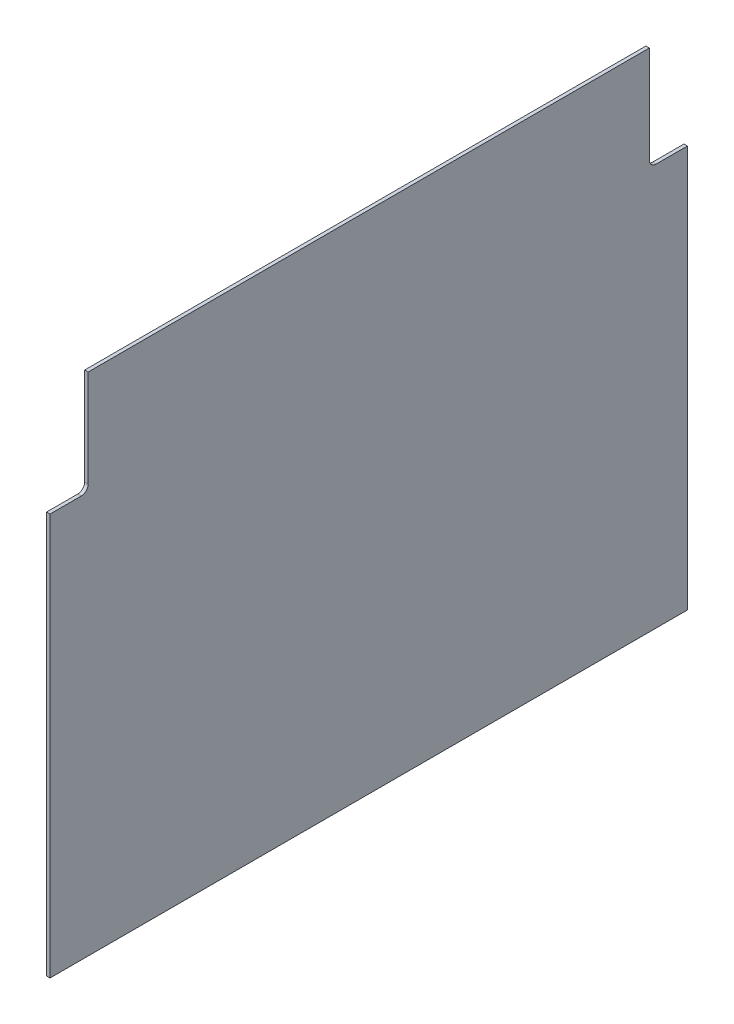
ISO-10303-21;
HEADER;
FILE_DESCRIPTION(('STEP AP214'),'2;1');
FILE_NAME('part.step','',(''),(''),'','','');
FILE_SCHEMA(('AUTOMOTIVE_DESIGN { 1 0 10303 214 1 1 1 1 }'));
ENDSEC;
DATA;
#1=APPLICATION_CONTEXT('core data for automotive mechanical design processes');
#2=APPLICATION_PROTOCOL_DEFINITION('international standard','automotive_design',2000,#1);
#3=PRODUCT_CONTEXT('',#1,'mechanical');
#4=PRODUCT('Part','Part','',(#3));
#5=PRODUCT_RELATED_PRODUCT_CATEGORY('part','',(#4));
#6=PRODUCT_DEFINITION_FORMATION('','',#4);
#7=PRODUCT_DEFINITION_CONTEXT('part definition',#1,'design');
#8=PRODUCT_DEFINITION('design','',#6,#7);
#9=PRODUCT_DEFINITION_SHAPE('','',#8);
#10=(LENGTH_UNIT() NAMED_UNIT(*) SI_UNIT(.MILLI.,.METRE.));
#11=(NAMED_UNIT(*) PLANE_ANGLE_UNIT() SI_UNIT($,.RADIAN.));
#12=(NAMED_UNIT(*) SI_UNIT($,.STERADIAN.) SOLID_ANGLE_UNIT());
#13=UNCERTAINTY_MEASURE_WITH_UNIT(LENGTH_MEASURE(1.E-05),#10,'distance_accuracy_value','');
#14=(GEOMETRIC_REPRESENTATION_CONTEXT(3) GLOBAL_UNCERTAINTY_ASSIGNED_CONTEXT((#13)) GLOBAL_UNIT_ASSIGNED_CONTEXT((#10,
#11,#12)) REPRESENTATION_CONTEXT('',''));
#15=CARTESIAN_POINT('',(0.,0.,0.));
#16=DIRECTION('',(0.,0.,1.));
#17=DIRECTION('',(1.,0.,0.));
#18=AXIS2_PLACEMENT_3D('',#15,#16,#17);
#19=CARTESIAN_POINT('',(3.175,0.,0.));
#20=DIRECTION('',(1.,0.,0.));
#21=DIRECTION('',(0.,0.,-1.));
#22=AXIS2_PLACEMENT_3D('',#19,#20,#21);
#23=PLANE('',#22);
#24=CARTESIAN_POINT('',(3.175,374.65,-555.625));
#25=DIRECTION('',(1.,0.,0.));
#26=DIRECTION('',(0.,0.,-1.));
#27=AXIS2_PLACEMENT_3D('',#24,#25,#26);
#28=CIRCLE('',#27,6.35);
#29=CARTESIAN_POINT('',(3.175,368.3,-555.625));
#30=VERTEX_POINT('',#29);
#31=CARTESIAN_POINT('',(3.175,374.65,-549.275));
#32=VERTEX_POINT('',#31);
#33=EDGE_CURVE('E19',#30,#32,#28,.F.);
#34=ORIENTED_EDGE('',*,*,#33,.T.);
#35=DIRECTION('',(0.,1.,0.));
#36=VECTOR('',#35,1.);
#37=CARTESIAN_POINT('',(3.175,368.3,-549.275));
#38=LINE('',#37,#36);
#39=CARTESIAN_POINT('',(3.175,463.55,-549.275));
#40=VERTEX_POINT('',#39);
#41=EDGE_CURVE('E95',#40,#32,#38,.F.);
#42=ORIENTED_EDGE('',*,*,#41,.F.);
#43=DIRECTION('',(0.,0.,1.));
#44=VECTOR('',#43,1.);
#45=CARTESIAN_POINT('',(3.175,463.55,-549.275));
#46=LINE('',#45,#44);
#47=CARTESIAN_POINT('',(3.175,463.55,-34.925));
#48=VERTEX_POINT('',#47);
#49=EDGE_CURVE('E111',#48,#40,#46,.F.);
#50=ORIENTED_EDGE('',*,*,#49,.F.);
#51=DIRECTION('',(0.,1.,0.));
#52=VECTOR('',#51,1.);
#53=CARTESIAN_POINT('',(3.175,463.55,-34.925));
#54=LINE('',#53,#52);
#55=CARTESIAN_POINT('',(3.175,374.65,-34.925));
#56=VERTEX_POINT('',#55);
#57=EDGE_CURVE('E152',#56,#48,#54,.T.);
#58=ORIENTED_EDGE('',*,*,#57,.F.);
#59=CARTESIAN_POINT('',(3.175,374.65,-28.575));
#60=DIRECTION('',(1.,0.,0.));
#61=DIRECTION('',(0.,0.,-1.));
#62=AXIS2_PLACEMENT_3D('',#59,#60,#61);
#63=CIRCLE('',#62,6.35);
#64=CARTESIAN_POINT('',(3.175,368.3,-28.575));
#65=VERTEX_POINT('',#64);
#66=EDGE_CURVE('E137',#56,#65,#63,.F.);
#67=ORIENTED_EDGE('',*,*,#66,.T.);
#68=DIRECTION('',(0.,0.,1.));
#69=VECTOR('',#68,1.);
#70=CARTESIAN_POINT('',(3.175,368.3,-34.925));
#71=LINE('',#70,#69);
#72=CARTESIAN_POINT('',(3.175,368.3,0.));
#73=VERTEX_POINT('',#72);
#74=EDGE_CURVE('E134',#73,#65,#71,.F.);
#75=ORIENTED_EDGE('',*,*,#74,.F.);
#76=DIRECTION('',(0.,1.,0.));
#77=VECTOR('',#76,1.);
#78=CARTESIAN_POINT('',(3.175,368.3,0.));
#79=LINE('',#78,#77);
#80=CARTESIAN_POINT('',(3.175,0.,0.));
#81=VERTEX_POINT('',#80);
#82=EDGE_CURVE('E140',#81,#73,#79,.T.);
#83=ORIENTED_EDGE('',*,*,#82,.F.);
#84=DIRECTION('',(0.,0.,-1.));
#85=VECTOR('',#84,1.);
#86=CARTESIAN_POINT('',(3.175,0.,0.));
#87=LINE('',#86,#85);
#88=CARTESIAN_POINT('',(3.175,0.,-584.2));
#89=VERTEX_POINT('',#88);
#90=EDGE_CURVE('E145',#89,#81,#87,.F.);
#91=ORIENTED_EDGE('',*,*,#90,.F.);
#92=DIRECTION('',(0.,1.,0.));
#93=VECTOR('',#92,1.);
#94=CARTESIAN_POINT('',(3.175,0.,-584.2));
#95=LINE('',#94,#93);
#96=CARTESIAN_POINT('',(3.175,368.3,-584.2));
#97=VERTEX_POINT('',#96);
#98=EDGE_CURVE('E122',#97,#89,#95,.F.);
#99=ORIENTED_EDGE('',*,*,#98,.F.);
#100=DIRECTION('',(0.,0.,1.));
#101=VECTOR('',#100,1.);
#102=CARTESIAN_POINT('',(3.175,368.3,-584.2));
#103=LINE('',#102,#101);
#104=EDGE_CURVE('E89',#30,#97,#103,.F.);
#105=ORIENTED_EDGE('',*,*,#104,.F.);
#106=EDGE_LOOP('',(#34,#42,#50,#58,#67,#75,#83,#91,#99,#105));
#107=FACE_BOUND('',#106,.T.);
#108=ADVANCED_FACE('F16',(#107),#23,.T.);
#109=CARTESIAN_POINT('',(0.,368.3,-584.2));
#110=DIRECTION('',(0.,1.,0.));
#111=DIRECTION('',(0.,0.,1.));
#112=AXIS2_PLACEMENT_3D('',#109,#110,#111);
#113=PLANE('',#112);
#114=DIRECTION('',(0.,0.,-1.));
#115=VECTOR('',#114,1.);
#116=CARTESIAN_POINT('',(0.,368.3,0.));
#117=LINE('',#116,#115);
#118=CARTESIAN_POINT('',(0.,368.3,-584.2));
#119=VERTEX_POINT('',#118);
#120=CARTESIAN_POINT('',(0.,368.3,-555.625));
#121=VERTEX_POINT('',#120);
#122=EDGE_CURVE('E167',#119,#121,#117,.F.);
#123=ORIENTED_EDGE('',*,*,#122,.T.);
#124=DIRECTION('',(1.,0.,0.));
#125=VECTOR('',#124,1.);
#126=CARTESIAN_POINT('',(-7.95655,368.3,-555.625));
#127=LINE('',#126,#125);
#128=EDGE_CURVE('E106',#121,#30,#127,.T.);
#129=ORIENTED_EDGE('',*,*,#128,.T.);
#130=ORIENTED_EDGE('',*,*,#104,.T.);
#131=DIRECTION('',(-1.,0.,0.));
#132=VECTOR('',#131,1.);
#133=CARTESIAN_POINT('',(0.,368.3,-584.2));
#134=LINE('',#133,#132);
#135=EDGE_CURVE('E119',#119,#97,#134,.F.);
#136=ORIENTED_EDGE('',*,*,#135,.F.);
#137=EDGE_LOOP('',(#123,#129,#130,#136));
#138=FACE_BOUND('',#137,.T.);
#139=ADVANCED_FACE('F318',(#138),#113,.T.);
#140=CARTESIAN_POINT('',(-7.95655,374.65,-555.625));
#141=DIRECTION('',(1.,0.,0.));
#142=DIRECTION('',(0.,0.,-1.));
#143=AXIS2_PLACEMENT_3D('',#140,#141,#142);
#144=CYLINDRICAL_SURFACE('',#143,6.35);
#145=ORIENTED_EDGE('',*,*,#128,.F.);
#146=CARTESIAN_POINT('',(0.,374.65,-555.625));
#147=DIRECTION('',(1.,0.,0.));
#148=DIRECTION('',(0.,0.,-1.));
#149=AXIS2_PLACEMENT_3D('',#146,#147,#148);
#150=CIRCLE('',#149,6.35);
#151=CARTESIAN_POINT('',(0.,374.65,-549.275));
#152=VERTEX_POINT('',#151);
#153=EDGE_CURVE('E110',#121,#152,#150,.F.);
#154=ORIENTED_EDGE('',*,*,#153,.T.);
#155=DIRECTION('',(-1.,0.,0.));
#156=VECTOR('',#155,1.);
#157=CARTESIAN_POINT('',(0.,374.65,-549.275));
#158=LINE('',#157,#156);
#159=EDGE_CURVE('E99',#32,#152,#158,.T.);
#160=ORIENTED_EDGE('',*,*,#159,.F.);
#161=ORIENTED_EDGE('',*,*,#33,.F.);
#162=EDGE_LOOP('',(#145,#154,#160,#161));
#163=FACE_BOUND('',#162,.T.);
#164=ADVANCED_FACE('F108',(#163),#144,.F.);
#165=CARTESIAN_POINT('',(0.,368.3,-549.275));
#166=DIRECTION('',(0.,0.,-1.));
#167=DIRECTION('',(-1.,0.,0.));
#168=AXIS2_PLACEMENT_3D('',#165,#166,#167);
#169=PLANE('',#168);
#170=ORIENTED_EDGE('',*,*,#41,.T.);
#171=ORIENTED_EDGE('',*,*,#159,.T.);
#172=DIRECTION('',(0.,1.,0.));
#173=VECTOR('',#172,1.);
#174=CARTESIAN_POINT('',(0.,0.,-549.275));
#175=LINE('',#174,#173);
#176=CARTESIAN_POINT('',(0.,463.55,-549.275));
#177=VERTEX_POINT('',#176);
#178=EDGE_CURVE('E166',#152,#177,#175,.T.);
#179=ORIENTED_EDGE('',*,*,#178,.T.);
#180=DIRECTION('',(1.,0.,0.));
#181=VECTOR('',#180,1.);
#182=CARTESIAN_POINT('',(0.,463.55,-549.275));
#183=LINE('',#182,#181);
#184=EDGE_CURVE('E101',#40,#177,#183,.F.);
#185=ORIENTED_EDGE('',*,*,#184,.F.);
#186=EDGE_LOOP('',(#170,#171,#179,#185));
#187=FACE_BOUND('',#186,.T.);
#188=ADVANCED_FACE('F96',(#187),#169,.T.);
#189=CARTESIAN_POINT('',(0.,463.55,-549.275));
#190=DIRECTION('',(0.,1.,0.));
#191=DIRECTION('',(0.,0.,1.));
#192=AXIS2_PLACEMENT_3D('',#189,#190,#191);
#193=PLANE('',#192);
#194=ORIENTED_EDGE('',*,*,#184,.T.);
#195=DIRECTION('',(0.,0.,-1.));
#196=VECTOR('',#195,1.);
#197=CARTESIAN_POINT('',(0.,463.55,0.));
#198=LINE('',#197,#196);
#199=CARTESIAN_POINT('',(0.,463.55,-34.925));
#200=VERTEX_POINT('',#199);
#201=EDGE_CURVE('E184',#177,#200,#198,.F.);
#202=ORIENTED_EDGE('',*,*,#201,.T.);
#203=DIRECTION('',(1.,0.,0.));
#204=VECTOR('',#203,1.);
#205=CARTESIAN_POINT('',(0.,463.55,-34.925));
#206=LINE('',#205,#204);
#207=EDGE_CURVE('E154',#48,#200,#206,.F.);
#208=ORIENTED_EDGE('',*,*,#207,.F.);
#209=ORIENTED_EDGE('',*,*,#49,.T.);
#210=EDGE_LOOP('',(#194,#202,#208,#209));
#211=FACE_BOUND('',#210,.T.);
#212=ADVANCED_FACE('F190',(#211),#193,.T.);
#213=CARTESIAN_POINT('',(0.,463.55,-34.925));
#214=DIRECTION('',(0.,0.,1.));
#215=DIRECTION('',(1.,0.,0.));
#216=AXIS2_PLACEMENT_3D('',#213,#214,#215);
#217=PLANE('',#216);
#218=DIRECTION('',(0.,1.,0.));
#219=VECTOR('',#218,1.);
#220=CARTESIAN_POINT('',(0.,0.,-34.925));
#221=LINE('',#220,#219);
#222=CARTESIAN_POINT('',(0.,374.65,-34.925));
#223=VERTEX_POINT('',#222);
#224=EDGE_CURVE('E165',#200,#223,#221,.F.);
#225=ORIENTED_EDGE('',*,*,#224,.T.);
#226=DIRECTION('',(1.,0.,0.));
#227=VECTOR('',#226,1.);
#228=CARTESIAN_POINT('',(-7.95655,374.65,-34.925));
#229=LINE('',#228,#227);
#230=EDGE_CURVE('E169',#223,#56,#229,.T.);
#231=ORIENTED_EDGE('',*,*,#230,.T.);
#232=ORIENTED_EDGE('',*,*,#57,.T.);
#233=ORIENTED_EDGE('',*,*,#207,.T.);
#234=EDGE_LOOP('',(#225,#231,#232,#233));
#235=FACE_BOUND('',#234,.T.);
#236=ADVANCED_FACE('F229',(#235),#217,.T.);
#237=CARTESIAN_POINT('',(-7.95655,374.65,-28.575));
#238=DIRECTION('',(1.,0.,0.));
#239=DIRECTION('',(0.,0.,-1.));
#240=AXIS2_PLACEMENT_3D('',#237,#238,#239);
#241=CYLINDRICAL_SURFACE('',#240,6.35);
#242=ORIENTED_EDGE('',*,*,#230,.F.);
#243=CARTESIAN_POINT('',(0.,374.65,-28.575));
#244=DIRECTION('',(1.,0.,0.));
#245=DIRECTION('',(0.,0.,-1.));
#246=AXIS2_PLACEMENT_3D('',#243,#244,#245);
#247=CIRCLE('',#246,6.35);
#248=CARTESIAN_POINT('',(0.,368.3,-28.575));
#249=VERTEX_POINT('',#248);
#250=EDGE_CURVE('E161',#223,#249,#247,.F.);
#251=ORIENTED_EDGE('',*,*,#250,.T.);
#252=DIRECTION('',(1.,0.,0.));
#253=VECTOR('',#252,1.);
#254=CARTESIAN_POINT('',(0.,368.3,-28.575));
#255=LINE('',#254,#253);
#256=EDGE_CURVE('E136',#65,#249,#255,.F.);
#257=ORIENTED_EDGE('',*,*,#256,.F.);
#258=ORIENTED_EDGE('',*,*,#66,.F.);
#259=EDGE_LOOP('',(#242,#251,#257,#258));
#260=FACE_BOUND('',#259,.T.);
#261=ADVANCED_FACE('F231',(#260),#241,.F.);
#262=CARTESIAN_POINT('',(0.,368.3,-34.925));
#263=DIRECTION('',(0.,1.,0.));
#264=DIRECTION('',(0.,0.,1.));
#265=AXIS2_PLACEMENT_3D('',#262,#263,#264);
#266=PLANE('',#265);
#267=ORIENTED_EDGE('',*,*,#74,.T.);
#268=ORIENTED_EDGE('',*,*,#256,.T.);
#269=DIRECTION('',(0.,0.,-1.));
#270=VECTOR('',#269,1.);
#271=CARTESIAN_POINT('',(0.,368.3,0.));
#272=LINE('',#271,#270);
#273=CARTESIAN_POINT('',(0.,368.3,0.));
#274=VERTEX_POINT('',#273);
#275=EDGE_CURVE('E164',#249,#274,#272,.F.);
#276=ORIENTED_EDGE('',*,*,#275,.T.);
#277=DIRECTION('',(1.,0.,0.));
#278=VECTOR('',#277,1.);
#279=CARTESIAN_POINT('',(0.,368.3,0.));
#280=LINE('',#279,#278);
#281=EDGE_CURVE('E142',#73,#274,#280,.F.);
#282=ORIENTED_EDGE('',*,*,#281,.F.);
#283=EDGE_LOOP('',(#267,#268,#276,#282));
#284=FACE_BOUND('',#283,.T.);
#285=ADVANCED_FACE('F224',(#284),#266,.T.);
#286=CARTESIAN_POINT('',(0.,368.3,0.));
#287=DIRECTION('',(0.,0.,1.));
#288=DIRECTION('',(1.,0.,0.));
#289=AXIS2_PLACEMENT_3D('',#286,#287,#288);
#290=PLANE('',#289);
#291=ORIENTED_EDGE('',*,*,#281,.T.);
#292=DIRECTION('',(0.,1.,0.));
#293=VECTOR('',#292,1.);
#294=CARTESIAN_POINT('',(0.,0.,0.));
#295=LINE('',#294,#293);
#296=CARTESIAN_POINT('',(0.,0.,0.));
#297=VERTEX_POINT('',#296);
#298=EDGE_CURVE('E210',#274,#297,#295,.F.);
#299=ORIENTED_EDGE('',*,*,#298,.T.);
#300=DIRECTION('',(1.,0.,0.));
#301=VECTOR('',#300,1.);
#302=CARTESIAN_POINT('',(0.,0.,0.));
#303=LINE('',#302,#301);
#304=EDGE_CURVE('E123',#81,#297,#303,.F.);
#305=ORIENTED_EDGE('',*,*,#304,.F.);
#306=ORIENTED_EDGE('',*,*,#82,.T.);
#307=EDGE_LOOP('',(#291,#299,#305,#306));
#308=FACE_BOUND('',#307,.T.);
#309=ADVANCED_FACE('F217',(#308),#290,.T.);
#310=CARTESIAN_POINT('',(0.,0.,0.));
#311=DIRECTION('',(0.,-1.,0.));
#312=DIRECTION('',(0.,0.,-1.));
#313=AXIS2_PLACEMENT_3D('',#310,#311,#312);
#314=PLANE('',#313);
#315=ORIENTED_EDGE('',*,*,#304,.T.);
#316=DIRECTION('',(0.,0.,-1.));
#317=VECTOR('',#316,1.);
#318=CARTESIAN_POINT('',(0.,0.,0.));
#319=LINE('',#318,#317);
#320=CARTESIAN_POINT('',(0.,0.,-584.2));
#321=VERTEX_POINT('',#320);
#322=EDGE_CURVE('E25',#297,#321,#319,.T.);
#323=ORIENTED_EDGE('',*,*,#322,.T.);
#324=DIRECTION('',(-1.,0.,0.));
#325=VECTOR('',#324,1.);
#326=CARTESIAN_POINT('',(0.,0.,-584.2));
#327=LINE('',#326,#325);
#328=EDGE_CURVE('E33',#89,#321,#327,.T.);
#329=ORIENTED_EDGE('',*,*,#328,.F.);
#330=ORIENTED_EDGE('',*,*,#90,.T.);
#331=EDGE_LOOP('',(#315,#323,#329,#330));
#332=FACE_BOUND('',#331,.T.);
#333=ADVANCED_FACE('F247',(#332),#314,.T.);
#334=CARTESIAN_POINT('',(0.,0.,-584.2));
#335=DIRECTION('',(0.,0.,-1.));
#336=DIRECTION('',(-1.,0.,0.));
#337=AXIS2_PLACEMENT_3D('',#334,#335,#336);
#338=PLANE('',#337);
#339=ORIENTED_EDGE('',*,*,#328,.T.);
#340=DIRECTION('',(0.,1.,0.));
#341=VECTOR('',#340,1.);
#342=CARTESIAN_POINT('',(0.,0.,-584.2));
#343=LINE('',#342,#341);
#344=EDGE_CURVE('E11',#321,#119,#343,.T.);
#345=ORIENTED_EDGE('',*,*,#344,.T.);
#346=ORIENTED_EDGE('',*,*,#135,.T.);
#347=ORIENTED_EDGE('',*,*,#98,.T.);
#348=EDGE_LOOP('',(#339,#345,#346,#347));
#349=FACE_BOUND('',#348,.T.);
#350=ADVANCED_FACE('F242',(#349),#338,.T.);
#351=CARTESIAN_POINT('',(0.,0.,0.));
#352=DIRECTION('',(1.,0.,0.));
#353=DIRECTION('',(0.,0.,-1.));
#354=AXIS2_PLACEMENT_3D('',#351,#352,#353);
#355=PLANE('',#354);
#356=ORIENTED_EDGE('',*,*,#322,.F.);
#357=ORIENTED_EDGE('',*,*,#298,.F.);
#358=ORIENTED_EDGE('',*,*,#275,.F.);
#359=ORIENTED_EDGE('',*,*,#250,.F.);
#360=ORIENTED_EDGE('',*,*,#224,.F.);
#361=ORIENTED_EDGE('',*,*,#201,.F.);
#362=ORIENTED_EDGE('',*,*,#178,.F.);
#363=ORIENTED_EDGE('',*,*,#153,.F.);
#364=ORIENTED_EDGE('',*,*,#122,.F.);
#365=ORIENTED_EDGE('',*,*,#344,.F.);
#366=EDGE_LOOP('',(#356,#357,#358,#359,#360,#361,#362,#363,#364,#365));
#367=FACE_BOUND('',#366,.T.);
#368=ADVANCED_FACE('F195',(#367),#355,.F.);
#369=CLOSED_SHELL('',(#108,#139,#164,#188,#212,#236,#261,#285,#309,#333,#350,#368));
#370=MANIFOLD_SOLID_BREP('B1',#369);
#371=ADVANCED_BREP_SHAPE_REPRESENTATION('',(#18,#370),#14);
#372=SHAPE_DEFINITION_REPRESENTATION(#9,#371);
ENDSEC;
END-ISO-10303-21;
